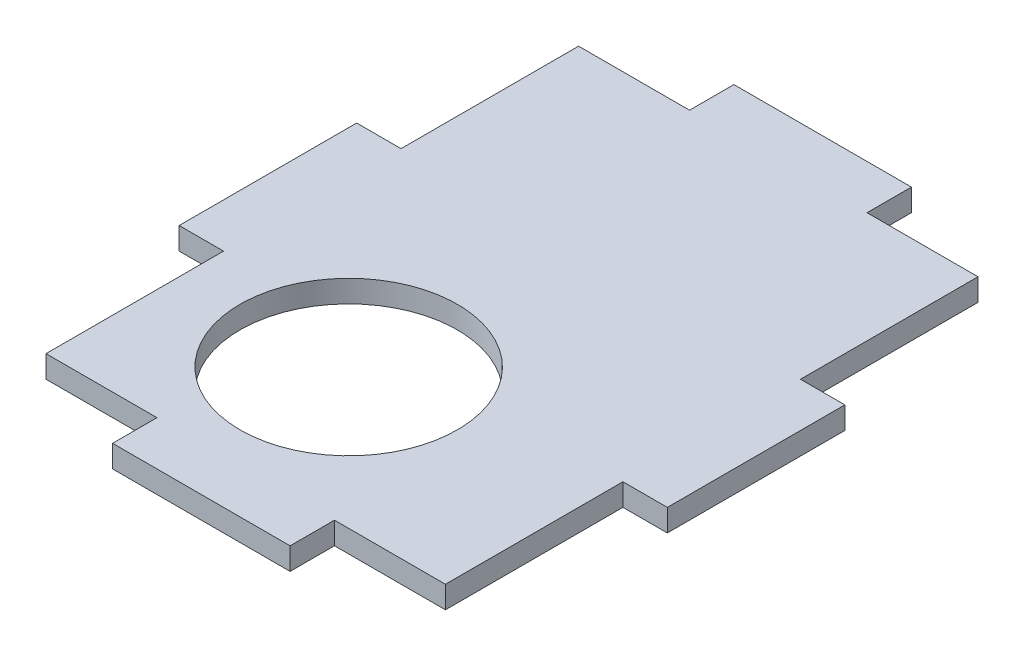
ISO-10303-21;
HEADER;
FILE_DESCRIPTION(('STEP AP214'),'2;1');
FILE_NAME('part.step','',(''),(''),'','','');
FILE_SCHEMA(('AUTOMOTIVE_DESIGN { 1 0 10303 214 1 1 1 1 }'));
ENDSEC;
DATA;
#1=APPLICATION_CONTEXT('core data for automotive mechanical design processes');
#2=APPLICATION_PROTOCOL_DEFINITION('international standard','automotive_design',2000,#1);
#3=PRODUCT_CONTEXT('',#1,'mechanical');
#4=PRODUCT('Part','Part','',(#3));
#5=PRODUCT_RELATED_PRODUCT_CATEGORY('part','',(#4));
#6=PRODUCT_DEFINITION_FORMATION('','',#4);
#7=PRODUCT_DEFINITION_CONTEXT('part definition',#1,'design');
#8=PRODUCT_DEFINITION('design','',#6,#7);
#9=PRODUCT_DEFINITION_SHAPE('','',#8);
#10=(LENGTH_UNIT() NAMED_UNIT(*) SI_UNIT(.MILLI.,.METRE.));
#11=(NAMED_UNIT(*) PLANE_ANGLE_UNIT() SI_UNIT($,.RADIAN.));
#12=(NAMED_UNIT(*) SI_UNIT($,.STERADIAN.) SOLID_ANGLE_UNIT());
#13=UNCERTAINTY_MEASURE_WITH_UNIT(LENGTH_MEASURE(1.E-05),#10,'distance_accuracy_value','');
#14=(GEOMETRIC_REPRESENTATION_CONTEXT(3) GLOBAL_UNCERTAINTY_ASSIGNED_CONTEXT((#13)) GLOBAL_UNIT_ASSIGNED_CONTEXT((#10,
#11,#12)) REPRESENTATION_CONTEXT('',''));
#15=CARTESIAN_POINT('',(0.,0.,0.));
#16=DIRECTION('',(0.,0.,1.));
#17=DIRECTION('',(1.,0.,0.));
#18=AXIS2_PLACEMENT_3D('',#15,#16,#17);
#19=CARTESIAN_POINT('',(0.,5.,0.));
#20=DIRECTION('',(-1.,0.,0.));
#21=DIRECTION('',(0.,0.,1.));
#22=AXIS2_PLACEMENT_3D('',#19,#20,#21);
#23=PLANE('',#22);
#24=DIRECTION('',(0.,0.,-1.));
#25=VECTOR('',#24,1.);
#26=CARTESIAN_POINT('',(0.,0.,0.));
#27=LINE('',#26,#25);
#28=CARTESIAN_POINT('',(0.,0.,0.));
#29=VERTEX_POINT('',#28);
#30=CARTESIAN_POINT('',(0.,0.,-40.));
#31=VERTEX_POINT('',#30);
#32=EDGE_CURVE('E202',#29,#31,#27,.T.);
#33=ORIENTED_EDGE('',*,*,#32,.F.);
#34=DIRECTION('',(0.,-1.,0.));
#35=VECTOR('',#34,1.);
#36=CARTESIAN_POINT('',(0.,5.,0.));
#37=LINE('',#36,#35);
#38=CARTESIAN_POINT('',(0.,5.,0.));
#39=VERTEX_POINT('',#38);
#40=EDGE_CURVE('E211',#39,#29,#37,.T.);
#41=ORIENTED_EDGE('',*,*,#40,.F.);
#42=DIRECTION('',(0.,0.,-1.));
#43=VECTOR('',#42,1.);
#44=CARTESIAN_POINT('',(0.,5.,0.));
#45=LINE('',#44,#43);
#46=CARTESIAN_POINT('',(0.,5.,-40.));
#47=VERTEX_POINT('',#46);
#48=EDGE_CURVE('E156',#39,#47,#45,.T.);
#49=ORIENTED_EDGE('',*,*,#48,.T.);
#50=DIRECTION('',(0.,-1.,0.));
#51=VECTOR('',#50,1.);
#52=CARTESIAN_POINT('',(0.,5.,-40.));
#53=LINE('',#52,#51);
#54=EDGE_CURVE('E215',#47,#31,#53,.T.);
#55=ORIENTED_EDGE('',*,*,#54,.T.);
#56=EDGE_LOOP('',(#33,#41,#49,#55));
#57=FACE_BOUND('',#56,.T.);
#58=ADVANCED_FACE('F41',(#57),#23,.T.);
#59=CARTESIAN_POINT('',(0.,5.,-40.));
#60=DIRECTION('',(0.,0.,1.));
#61=DIRECTION('',(1.,0.,0.));
#62=AXIS2_PLACEMENT_3D('',#59,#60,#61);
#63=PLANE('',#62);
#64=DIRECTION('',(-1.,0.,0.));
#65=VECTOR('',#64,1.);
#66=CARTESIAN_POINT('',(0.,0.,-40.));
#67=LINE('',#66,#65);
#68=CARTESIAN_POINT('',(-9.99999999999999,0.,-40.));
#69=VERTEX_POINT('',#68);
#70=EDGE_CURVE('E208',#31,#69,#67,.T.);
#71=ORIENTED_EDGE('',*,*,#70,.F.);
#72=ORIENTED_EDGE('',*,*,#54,.F.);
#73=DIRECTION('',(-1.,0.,0.));
#74=VECTOR('',#73,1.);
#75=CARTESIAN_POINT('',(0.,5.,-40.));
#76=LINE('',#75,#74);
#77=CARTESIAN_POINT('',(-9.99999999999999,5.,-40.));
#78=VERTEX_POINT('',#77);
#79=EDGE_CURVE('E162',#47,#78,#76,.T.);
#80=ORIENTED_EDGE('',*,*,#79,.T.);
#81=DIRECTION('',(0.,-1.,0.));
#82=VECTOR('',#81,1.);
#83=CARTESIAN_POINT('',(-9.99999999999999,5.,-40.));
#84=LINE('',#83,#82);
#85=EDGE_CURVE('E218',#78,#69,#84,.T.);
#86=ORIENTED_EDGE('',*,*,#85,.T.);
#87=EDGE_LOOP('',(#71,#72,#80,#86));
#88=FACE_BOUND('',#87,.T.);
#89=ADVANCED_FACE('F396',(#88),#63,.T.);
#90=CARTESIAN_POINT('',(-9.99999999999999,5.,0.));
#91=DIRECTION('',(1.,0.,0.));
#92=DIRECTION('',(0.,0.,-1.));
#93=AXIS2_PLACEMENT_3D('',#90,#91,#92);
#94=PLANE('',#93);
#95=DIRECTION('',(0.,0.,1.));
#96=VECTOR('',#95,1.);
#97=CARTESIAN_POINT('',(-9.99999999999999,0.,0.));
#98=LINE('',#97,#96);
#99=CARTESIAN_POINT('',(-10.,0.,-80.));
#100=VERTEX_POINT('',#99);
#101=EDGE_CURVE('E205',#100,#69,#98,.T.);
#102=ORIENTED_EDGE('',*,*,#101,.T.);
#103=ORIENTED_EDGE('',*,*,#85,.F.);
#104=DIRECTION('',(0.,0.,1.));
#105=VECTOR('',#104,1.);
#106=CARTESIAN_POINT('',(-9.99999999999999,5.,0.));
#107=LINE('',#106,#105);
#108=CARTESIAN_POINT('',(-10.,5.,-80.));
#109=VERTEX_POINT('',#108);
#110=EDGE_CURVE('E159',#109,#78,#107,.T.);
#111=ORIENTED_EDGE('',*,*,#110,.F.);
#112=DIRECTION('',(0.,-1.,0.));
#113=VECTOR('',#112,1.);
#114=CARTESIAN_POINT('',(-10.,5.,-80.));
#115=LINE('',#114,#113);
#116=EDGE_CURVE('E221',#109,#100,#115,.T.);
#117=ORIENTED_EDGE('',*,*,#116,.T.);
#118=EDGE_LOOP('',(#102,#103,#111,#117));
#119=FACE_BOUND('',#118,.T.);
#120=ADVANCED_FACE('F403',(#119),#94,.F.);
#121=CARTESIAN_POINT('',(0.,5.,-80.));
#122=DIRECTION('',(0.,0.,1.));
#123=DIRECTION('',(1.,0.,0.));
#124=AXIS2_PLACEMENT_3D('',#121,#122,#123);
#125=PLANE('',#124);
#126=DIRECTION('',(-1.,0.,0.));
#127=VECTOR('',#126,1.);
#128=CARTESIAN_POINT('',(0.,0.,-80.));
#129=LINE('',#128,#127);
#130=CARTESIAN_POINT('',(0.,0.,-80.));
#131=VERTEX_POINT('',#130);
#132=EDGE_CURVE('E201',#131,#100,#129,.T.);
#133=ORIENTED_EDGE('',*,*,#132,.T.);
#134=ORIENTED_EDGE('',*,*,#116,.F.);
#135=DIRECTION('',(-1.,0.,0.));
#136=VECTOR('',#135,1.);
#137=CARTESIAN_POINT('',(0.,5.,-80.));
#138=LINE('',#137,#136);
#139=CARTESIAN_POINT('',(0.,5.,-80.));
#140=VERTEX_POINT('',#139);
#141=EDGE_CURVE('E155',#140,#109,#138,.T.);
#142=ORIENTED_EDGE('',*,*,#141,.F.);
#143=DIRECTION('',(0.,-1.,0.));
#144=VECTOR('',#143,1.);
#145=CARTESIAN_POINT('',(0.,5.,-80.));
#146=LINE('',#145,#144);
#147=EDGE_CURVE('E224',#140,#131,#146,.T.);
#148=ORIENTED_EDGE('',*,*,#147,.T.);
#149=EDGE_LOOP('',(#133,#134,#142,#148));
#150=FACE_BOUND('',#149,.T.);
#151=ADVANCED_FACE('F422',(#150),#125,.F.);
#152=CARTESIAN_POINT('',(-1.11022302462516E-13,5.,-79.9999999999999));
#153=DIRECTION('',(0.,0.,-1.));
#154=DIRECTION('',(-1.,0.,0.));
#155=AXIS2_PLACEMENT_3D('',#152,#153,#154);
#156=PLANE('',#155);
#157=DIRECTION('',(1.,0.,0.));
#158=VECTOR('',#157,1.);
#159=CARTESIAN_POINT('',(-1.11022302462516E-13,0.,-79.9999999999999));
#160=LINE('',#159,#158);
#161=CARTESIAN_POINT('',(90.,0.,-80.));
#162=VERTEX_POINT('',#161);
#163=CARTESIAN_POINT('',(100.,0.,-80.));
#164=VERTEX_POINT('',#163);
#165=EDGE_CURVE('E192',#162,#164,#160,.T.);
#166=ORIENTED_EDGE('',*,*,#165,.F.);
#167=DIRECTION('',(0.,-1.,0.));
#168=VECTOR('',#167,1.);
#169=CARTESIAN_POINT('',(90.,5.,-80.));
#170=LINE('',#169,#168);
#171=CARTESIAN_POINT('',(90.,5.,-80.));
#172=VERTEX_POINT('',#171);
#173=EDGE_CURVE('E232',#172,#162,#170,.T.);
#174=ORIENTED_EDGE('',*,*,#173,.F.);
#175=DIRECTION('',(1.,0.,0.));
#176=VECTOR('',#175,1.);
#177=CARTESIAN_POINT('',(-1.11022302462516E-13,5.,-79.9999999999999));
#178=LINE('',#177,#176);
#179=CARTESIAN_POINT('',(100.,5.,-80.));
#180=VERTEX_POINT('',#179);
#181=EDGE_CURVE('E147',#172,#180,#178,.T.);
#182=ORIENTED_EDGE('',*,*,#181,.T.);
#183=DIRECTION('',(0.,-1.,0.));
#184=VECTOR('',#183,1.);
#185=CARTESIAN_POINT('',(100.,5.,-80.));
#186=LINE('',#185,#184);
#187=EDGE_CURVE('E235',#180,#164,#186,.T.);
#188=ORIENTED_EDGE('',*,*,#187,.T.);
#189=EDGE_LOOP('',(#166,#174,#182,#188));
#190=FACE_BOUND('',#189,.T.);
#191=ADVANCED_FACE('F312',(#190),#156,.T.);
#192=CARTESIAN_POINT('',(100.,5.,0.));
#193=DIRECTION('',(1.,0.,0.));
#194=DIRECTION('',(0.,0.,-1.));
#195=AXIS2_PLACEMENT_3D('',#192,#193,#194);
#196=PLANE('',#195);
#197=DIRECTION('',(0.,0.,1.));
#198=VECTOR('',#197,1.);
#199=CARTESIAN_POINT('',(100.,0.,0.));
#200=LINE('',#199,#198);
#201=CARTESIAN_POINT('',(100.,0.,-40.));
#202=VERTEX_POINT('',#201);
#203=EDGE_CURVE('E189',#164,#202,#200,.T.);
#204=ORIENTED_EDGE('',*,*,#203,.F.);
#205=ORIENTED_EDGE('',*,*,#187,.F.);
#206=DIRECTION('',(0.,0.,1.));
#207=VECTOR('',#206,1.);
#208=CARTESIAN_POINT('',(100.,5.,0.));
#209=LINE('',#208,#207);
#210=CARTESIAN_POINT('',(100.,5.,-40.));
#211=VERTEX_POINT('',#210);
#212=EDGE_CURVE('E296',#180,#211,#209,.T.);
#213=ORIENTED_EDGE('',*,*,#212,.T.);
#214=DIRECTION('',(0.,-1.,0.));
#215=VECTOR('',#214,1.);
#216=CARTESIAN_POINT('',(100.,5.,-40.));
#217=LINE('',#216,#215);
#218=EDGE_CURVE('E238',#211,#202,#217,.T.);
#219=ORIENTED_EDGE('',*,*,#218,.T.);
#220=EDGE_LOOP('',(#204,#205,#213,#219));
#221=FACE_BOUND('',#220,.T.);
#222=ADVANCED_FACE('F379',(#221),#196,.T.);
#223=CARTESIAN_POINT('',(0.,5.,-39.9999999999999));
#224=DIRECTION('',(0.,0.,-1.));
#225=DIRECTION('',(-1.,0.,0.));
#226=AXIS2_PLACEMENT_3D('',#223,#224,#225);
#227=PLANE('',#226);
#228=DIRECTION('',(1.,0.,0.));
#229=VECTOR('',#228,1.);
#230=CARTESIAN_POINT('',(0.,0.,-39.9999999999999));
#231=LINE('',#230,#229);
#232=CARTESIAN_POINT('',(90.,0.,-40.));
#233=VERTEX_POINT('',#232);
#234=EDGE_CURVE('E185',#233,#202,#231,.T.);
#235=ORIENTED_EDGE('',*,*,#234,.T.);
#236=ORIENTED_EDGE('',*,*,#218,.F.);
#237=DIRECTION('',(1.,0.,0.));
#238=VECTOR('',#237,1.);
#239=CARTESIAN_POINT('',(0.,5.,-39.9999999999999));
#240=LINE('',#239,#238);
#241=CARTESIAN_POINT('',(90.,5.,-40.));
#242=VERTEX_POINT('',#241);
#243=EDGE_CURVE('E294',#242,#211,#240,.T.);
#244=ORIENTED_EDGE('',*,*,#243,.F.);
#245=DIRECTION('',(0.,-1.,0.));
#246=VECTOR('',#245,1.);
#247=CARTESIAN_POINT('',(90.,5.,-40.));
#248=LINE('',#247,#246);
#249=EDGE_CURVE('E241',#242,#233,#248,.T.);
#250=ORIENTED_EDGE('',*,*,#249,.T.);
#251=EDGE_LOOP('',(#235,#236,#244,#250));
#252=FACE_BOUND('',#251,.T.);
#253=ADVANCED_FACE('F378',(#252),#227,.F.);
#254=CARTESIAN_POINT('',(90.,5.,0.));
#255=DIRECTION('',(-1.,0.,0.));
#256=DIRECTION('',(0.,0.,1.));
#257=AXIS2_PLACEMENT_3D('',#254,#255,#256);
#258=PLANE('',#257);
#259=DIRECTION('',(0.,0.,-1.));
#260=VECTOR('',#259,1.);
#261=CARTESIAN_POINT('',(90.,0.,0.));
#262=LINE('',#261,#260);
#263=CARTESIAN_POINT('',(90.,0.,0.));
#264=VERTEX_POINT('',#263);
#265=EDGE_CURVE('E182',#264,#233,#262,.T.);
#266=ORIENTED_EDGE('',*,*,#265,.T.);
#267=ORIENTED_EDGE('',*,*,#249,.F.);
#268=DIRECTION('',(0.,0.,-1.));
#269=VECTOR('',#268,1.);
#270=CARTESIAN_POINT('',(90.,5.,0.));
#271=LINE('',#270,#269);
#272=CARTESIAN_POINT('',(90.,5.,0.));
#273=VERTEX_POINT('',#272);
#274=EDGE_CURVE('E149',#273,#242,#271,.T.);
#275=ORIENTED_EDGE('',*,*,#274,.F.);
#276=DIRECTION('',(0.,-1.,0.));
#277=VECTOR('',#276,1.);
#278=CARTESIAN_POINT('',(90.,5.,0.));
#279=LINE('',#278,#277);
#280=EDGE_CURVE('E244',#273,#264,#279,.T.);
#281=ORIENTED_EDGE('',*,*,#280,.T.);
#282=EDGE_LOOP('',(#266,#267,#275,#281));
#283=FACE_BOUND('',#282,.T.);
#284=ADVANCED_FACE('F285',(#283),#258,.F.);
#285=CARTESIAN_POINT('',(0.,5.,0.));
#286=DIRECTION('',(0.,0.,-1.));
#287=DIRECTION('',(-1.,0.,0.));
#288=AXIS2_PLACEMENT_3D('',#285,#286,#287);
#289=PLANE('',#288);
#290=DIRECTION('',(1.,0.,0.));
#291=VECTOR('',#290,1.);
#292=CARTESIAN_POINT('',(0.,0.,0.));
#293=LINE('',#292,#291);
#294=CARTESIAN_POINT('',(65.,0.,0.));
#295=VERTEX_POINT('',#294);
#296=EDGE_CURVE('E172',#295,#264,#293,.T.);
#297=ORIENTED_EDGE('',*,*,#296,.T.);
#298=ORIENTED_EDGE('',*,*,#280,.F.);
#299=DIRECTION('',(1.,0.,0.));
#300=VECTOR('',#299,1.);
#301=CARTESIAN_POINT('',(0.,5.,0.));
#302=LINE('',#301,#300);
#303=CARTESIAN_POINT('',(65.,5.,0.));
#304=VERTEX_POINT('',#303);
#305=EDGE_CURVE('E295',#304,#273,#302,.T.);
#306=ORIENTED_EDGE('',*,*,#305,.F.);
#307=DIRECTION('',(0.,-1.,0.));
#308=VECTOR('',#307,1.);
#309=CARTESIAN_POINT('',(65.,5.,0.));
#310=LINE('',#309,#308);
#311=EDGE_CURVE('E247',#304,#295,#310,.T.);
#312=ORIENTED_EDGE('',*,*,#311,.T.);
#313=EDGE_LOOP('',(#297,#298,#306,#312));
#314=FACE_BOUND('',#313,.T.);
#315=ADVANCED_FACE('F278',(#314),#289,.F.);
#316=CARTESIAN_POINT('',(65.,5.,0.));
#317=DIRECTION('',(1.,0.,0.));
#318=DIRECTION('',(0.,0.,-1.));
#319=AXIS2_PLACEMENT_3D('',#316,#317,#318);
#320=PLANE('',#319);
#321=DIRECTION('',(0.,0.,1.));
#322=VECTOR('',#321,1.);
#323=CARTESIAN_POINT('',(65.,0.,0.));
#324=LINE('',#323,#322);
#325=CARTESIAN_POINT('',(65.,0.,10.));
#326=VERTEX_POINT('',#325);
#327=EDGE_CURVE('E179',#295,#326,#324,.T.);
#328=ORIENTED_EDGE('',*,*,#327,.F.);
#329=ORIENTED_EDGE('',*,*,#311,.F.);
#330=DIRECTION('',(0.,0.,1.));
#331=VECTOR('',#330,1.);
#332=CARTESIAN_POINT('',(65.,5.,0.));
#333=LINE('',#332,#331);
#334=CARTESIAN_POINT('',(65.,5.,10.));
#335=VERTEX_POINT('',#334);
#336=EDGE_CURVE('E261',#304,#335,#333,.T.);
#337=ORIENTED_EDGE('',*,*,#336,.T.);
#338=DIRECTION('',(0.,-1.,0.));
#339=VECTOR('',#338,1.);
#340=CARTESIAN_POINT('',(65.,5.,10.));
#341=LINE('',#340,#339);
#342=EDGE_CURVE('E125',#335,#326,#341,.T.);
#343=ORIENTED_EDGE('',*,*,#342,.T.);
#344=EDGE_LOOP('',(#328,#329,#337,#343));
#345=FACE_BOUND('',#344,.T.);
#346=ADVANCED_FACE('F256',(#345),#320,.T.);
#347=CARTESIAN_POINT('',(0.,5.,10.));
#348=DIRECTION('',(0.,0.,1.));
#349=DIRECTION('',(1.,0.,0.));
#350=AXIS2_PLACEMENT_3D('',#347,#348,#349);
#351=PLANE('',#350);
#352=DIRECTION('',(-1.,0.,0.));
#353=VECTOR('',#352,1.);
#354=CARTESIAN_POINT('',(0.,0.,10.));
#355=LINE('',#354,#353);
#356=CARTESIAN_POINT('',(25.,0.,10.));
#357=VERTEX_POINT('',#356);
#358=EDGE_CURVE('E175',#326,#357,#355,.T.);
#359=ORIENTED_EDGE('',*,*,#358,.F.);
#360=ORIENTED_EDGE('',*,*,#342,.F.);
#361=DIRECTION('',(-1.,0.,0.));
#362=VECTOR('',#361,1.);
#363=CARTESIAN_POINT('',(0.,5.,10.));
#364=LINE('',#363,#362);
#365=CARTESIAN_POINT('',(25.,5.,10.));
#366=VERTEX_POINT('',#365);
#367=EDGE_CURVE('E442',#335,#366,#364,.T.);
#368=ORIENTED_EDGE('',*,*,#367,.T.);
#369=DIRECTION('',(0.,-1.,0.));
#370=VECTOR('',#369,1.);
#371=CARTESIAN_POINT('',(25.,5.,10.));
#372=LINE('',#371,#370);
#373=EDGE_CURVE('E114',#366,#357,#372,.T.);
#374=ORIENTED_EDGE('',*,*,#373,.T.);
#375=EDGE_LOOP('',(#359,#360,#368,#374));
#376=FACE_BOUND('',#375,.T.);
#377=ADVANCED_FACE('F267',(#376),#351,.T.);
#378=CARTESIAN_POINT('',(25.,5.,0.));
#379=DIRECTION('',(1.,0.,0.));
#380=DIRECTION('',(0.,0.,-1.));
#381=AXIS2_PLACEMENT_3D('',#378,#379,#380);
#382=PLANE('',#381);
#383=DIRECTION('',(0.,0.,1.));
#384=VECTOR('',#383,1.);
#385=CARTESIAN_POINT('',(25.,0.,0.));
#386=LINE('',#385,#384);
#387=CARTESIAN_POINT('',(25.,0.,0.));
#388=VERTEX_POINT('',#387);
#389=EDGE_CURVE('E171',#388,#357,#386,.T.);
#390=ORIENTED_EDGE('',*,*,#389,.T.);
#391=ORIENTED_EDGE('',*,*,#373,.F.);
#392=DIRECTION('',(0.,0.,1.));
#393=VECTOR('',#392,1.);
#394=CARTESIAN_POINT('',(25.,5.,0.));
#395=LINE('',#394,#393);
#396=CARTESIAN_POINT('',(25.,5.,0.));
#397=VERTEX_POINT('',#396);
#398=EDGE_CURVE('E371',#397,#366,#395,.T.);
#399=ORIENTED_EDGE('',*,*,#398,.F.);
#400=DIRECTION('',(0.,-1.,0.));
#401=VECTOR('',#400,1.);
#402=CARTESIAN_POINT('',(25.,5.,0.));
#403=LINE('',#402,#401);
#404=EDGE_CURVE('E107',#397,#388,#403,.T.);
#405=ORIENTED_EDGE('',*,*,#404,.T.);
#406=EDGE_LOOP('',(#390,#391,#399,#405));
#407=FACE_BOUND('',#406,.T.);
#408=ADVANCED_FACE('F444',(#407),#382,.F.);
#409=EDGE_CURVE('E168',#29,#388,#293,.T.);
#410=ORIENTED_EDGE('',*,*,#409,.T.);
#411=ORIENTED_EDGE('',*,*,#404,.F.);
#412=EDGE_CURVE('E299',#39,#397,#302,.T.);
#413=ORIENTED_EDGE('',*,*,#412,.F.);
#414=ORIENTED_EDGE('',*,*,#40,.T.);
#415=EDGE_LOOP('',(#410,#411,#413,#414));
#416=FACE_BOUND('',#415,.T.);
#417=ADVANCED_FACE('F445',(#416),#289,.F.);
#418=CARTESIAN_POINT('',(36.72,5.,-31.48));
#419=DIRECTION('',(0.,-1.,0.));
#420=DIRECTION('',(0.,0.,-1.));
#421=AXIS2_PLACEMENT_3D('',#418,#419,#420);
#422=CYLINDRICAL_SURFACE('',#421,24.5);
#423=CARTESIAN_POINT('',(36.72,5.,-31.48));
#424=DIRECTION('',(0.,1.,0.));
#425=DIRECTION('',(0.,0.,1.));
#426=AXIS2_PLACEMENT_3D('',#423,#424,#425);
#427=CIRCLE('',#426,24.5);
#428=CARTESIAN_POINT('',(36.72,5.,-6.98));
#429=VERTEX_POINT('',#428);
#430=EDGE_CURVE('E434',#429,#429,#427,.T.);
#431=ORIENTED_EDGE('',*,*,#430,.T.);
#432=EDGE_LOOP('',(#431));
#433=FACE_BOUND('',#432,.T.);
#434=CARTESIAN_POINT('',(36.72,0.,-31.48));
#435=DIRECTION('',(0.,1.,0.));
#436=DIRECTION('',(0.,0.,1.));
#437=AXIS2_PLACEMENT_3D('',#434,#435,#436);
#438=CIRCLE('',#437,24.5);
#439=CARTESIAN_POINT('',(36.72,0.,-6.98));
#440=VERTEX_POINT('',#439);
#441=EDGE_CURVE('E90',#440,#440,#438,.T.);
#442=ORIENTED_EDGE('',*,*,#441,.F.);
#443=EDGE_LOOP('',(#442));
#444=FACE_BOUND('',#443,.T.);
#445=ADVANCED_FACE('F415',(#433,#444),#422,.F.);
#446=CARTESIAN_POINT('',(90.,0.,-120.));
#447=VERTEX_POINT('',#446);
#448=EDGE_CURVE('E186',#162,#447,#262,.T.);
#449=ORIENTED_EDGE('',*,*,#448,.T.);
#450=DIRECTION('',(0.,-1.,0.));
#451=VECTOR('',#450,1.);
#452=CARTESIAN_POINT('',(90.,5.,-120.));
#453=LINE('',#452,#451);
#454=CARTESIAN_POINT('',(90.,5.,-120.));
#455=VERTEX_POINT('',#454);
#456=EDGE_CURVE('E230',#455,#447,#453,.T.);
#457=ORIENTED_EDGE('',*,*,#456,.F.);
#458=EDGE_CURVE('E141',#172,#455,#271,.T.);
#459=ORIENTED_EDGE('',*,*,#458,.F.);
#460=ORIENTED_EDGE('',*,*,#173,.T.);
#461=EDGE_LOOP('',(#449,#457,#459,#460));
#462=FACE_BOUND('',#461,.T.);
#463=ADVANCED_FACE('F383',(#462),#258,.F.);
#464=CARTESIAN_POINT('',(0.,0.,-120.));
#465=VERTEX_POINT('',#464);
#466=EDGE_CURVE('E197',#131,#465,#27,.T.);
#467=ORIENTED_EDGE('',*,*,#466,.F.);
#468=ORIENTED_EDGE('',*,*,#147,.F.);
#469=CARTESIAN_POINT('',(0.,5.,-120.));
#470=VERTEX_POINT('',#469);
#471=EDGE_CURVE('E146',#140,#470,#45,.T.);
#472=ORIENTED_EDGE('',*,*,#471,.T.);
#473=DIRECTION('',(0.,-1.,0.));
#474=VECTOR('',#473,1.);
#475=CARTESIAN_POINT('',(0.,5.,-120.));
#476=LINE('',#475,#474);
#477=EDGE_CURVE('E227',#470,#465,#476,.T.);
#478=ORIENTED_EDGE('',*,*,#477,.T.);
#479=EDGE_LOOP('',(#467,#468,#472,#478));
#480=FACE_BOUND('',#479,.T.);
#481=ADVANCED_FACE('F399',(#480),#23,.T.);
#482=CARTESIAN_POINT('',(0.,0.,0.));
#483=DIRECTION('',(0.,1.,0.));
#484=DIRECTION('',(0.,0.,1.));
#485=AXIS2_PLACEMENT_3D('',#482,#483,#484);
#486=PLANE('',#485);
#487=ORIENTED_EDGE('',*,*,#441,.T.);
#488=EDGE_LOOP('',(#487));
#489=FACE_BOUND('',#488,.T.);
#490=ORIENTED_EDGE('',*,*,#409,.F.);
#491=ORIENTED_EDGE('',*,*,#32,.T.);
#492=ORIENTED_EDGE('',*,*,#70,.T.);
#493=ORIENTED_EDGE('',*,*,#101,.F.);
#494=ORIENTED_EDGE('',*,*,#132,.F.);
#495=ORIENTED_EDGE('',*,*,#466,.T.);
#496=DIRECTION('',(1.,0.,0.));
#497=VECTOR('',#496,1.);
#498=CARTESIAN_POINT('',(0.,0.,-120.));
#499=LINE('',#498,#497);
#500=CARTESIAN_POINT('',(25.,0.,-120.));
#501=VERTEX_POINT('',#500);
#502=EDGE_CURVE('E195',#465,#501,#499,.T.);
#503=ORIENTED_EDGE('',*,*,#502,.T.);
#504=DIRECTION('',(0.,0.,-1.));
#505=VECTOR('',#504,1.);
#506=CARTESIAN_POINT('',(25.,0.,-120.));
#507=LINE('',#506,#505);
#508=CARTESIAN_POINT('',(25.,0.,-130.));
#509=VERTEX_POINT('',#508);
#510=EDGE_CURVE('E101',#501,#509,#507,.T.);
#511=ORIENTED_EDGE('',*,*,#510,.T.);
#512=DIRECTION('',(1.,0.,0.));
#513=VECTOR('',#512,1.);
#514=CARTESIAN_POINT('',(25.,0.,-130.));
#515=LINE('',#514,#513);
#516=CARTESIAN_POINT('',(65.,0.,-130.));
#517=VERTEX_POINT('',#516);
#518=EDGE_CURVE('E85',#509,#517,#515,.T.);
#519=ORIENTED_EDGE('',*,*,#518,.T.);
#520=DIRECTION('',(0.,0.,-1.));
#521=VECTOR('',#520,1.);
#522=CARTESIAN_POINT('',(65.,0.,-120.));
#523=LINE('',#522,#521);
#524=CARTESIAN_POINT('',(65.,0.,-120.));
#525=VERTEX_POINT('',#524);
#526=EDGE_CURVE('E92',#525,#517,#523,.T.);
#527=ORIENTED_EDGE('',*,*,#526,.F.);
#528=EDGE_CURVE('E198',#525,#447,#499,.T.);
#529=ORIENTED_EDGE('',*,*,#528,.T.);
#530=ORIENTED_EDGE('',*,*,#448,.F.);
#531=ORIENTED_EDGE('',*,*,#165,.T.);
#532=ORIENTED_EDGE('',*,*,#203,.T.);
#533=ORIENTED_EDGE('',*,*,#234,.F.);
#534=ORIENTED_EDGE('',*,*,#265,.F.);
#535=ORIENTED_EDGE('',*,*,#296,.F.);
#536=ORIENTED_EDGE('',*,*,#327,.T.);
#537=ORIENTED_EDGE('',*,*,#358,.T.);
#538=ORIENTED_EDGE('',*,*,#389,.F.);
#539=EDGE_LOOP('',(#490,#491,#492,#493,#494,#495,#503,#511,#519,#527,#529,#530,#531,#532,#533,
#534,#535,#536,#537,#538));
#540=FACE_BOUND('',#539,.T.);
#541=ADVANCED_FACE('F99',(#489,#540),#486,.F.);
#542=CARTESIAN_POINT('',(0.,5.,0.));
#543=DIRECTION('',(0.,1.,0.));
#544=DIRECTION('',(0.,0.,1.));
#545=AXIS2_PLACEMENT_3D('',#542,#543,#544);
#546=PLANE('',#545);
#547=ORIENTED_EDGE('',*,*,#430,.F.);
#548=EDGE_LOOP('',(#547));
#549=FACE_BOUND('',#548,.T.);
#550=ORIENTED_EDGE('',*,*,#412,.T.);
#551=ORIENTED_EDGE('',*,*,#398,.T.);
#552=ORIENTED_EDGE('',*,*,#367,.F.);
#553=ORIENTED_EDGE('',*,*,#336,.F.);
#554=ORIENTED_EDGE('',*,*,#305,.T.);
#555=ORIENTED_EDGE('',*,*,#274,.T.);
#556=ORIENTED_EDGE('',*,*,#243,.T.);
#557=ORIENTED_EDGE('',*,*,#212,.F.);
#558=ORIENTED_EDGE('',*,*,#181,.F.);
#559=ORIENTED_EDGE('',*,*,#458,.T.);
#560=DIRECTION('',(1.,0.,0.));
#561=VECTOR('',#560,1.);
#562=CARTESIAN_POINT('',(0.,5.,-120.));
#563=LINE('',#562,#561);
#564=CARTESIAN_POINT('',(65.,5.,-120.));
#565=VERTEX_POINT('',#564);
#566=EDGE_CURVE('E137',#565,#455,#563,.T.);
#567=ORIENTED_EDGE('',*,*,#566,.F.);
#568=DIRECTION('',(0.,0.,-1.));
#569=VECTOR('',#568,1.);
#570=CARTESIAN_POINT('',(65.,5.,-120.));
#571=LINE('',#570,#569);
#572=CARTESIAN_POINT('',(65.,5.,-130.));
#573=VERTEX_POINT('',#572);
#574=EDGE_CURVE('E130',#565,#573,#571,.T.);
#575=ORIENTED_EDGE('',*,*,#574,.T.);
#576=DIRECTION('',(1.,0.,0.));
#577=VECTOR('',#576,1.);
#578=CARTESIAN_POINT('',(25.,5.,-130.));
#579=LINE('',#578,#577);
#580=CARTESIAN_POINT('',(25.,5.,-130.));
#581=VERTEX_POINT('',#580);
#582=EDGE_CURVE('E88',#581,#573,#579,.T.);
#583=ORIENTED_EDGE('',*,*,#582,.F.);
#584=DIRECTION('',(0.,0.,-1.));
#585=VECTOR('',#584,1.);
#586=CARTESIAN_POINT('',(25.,5.,-120.));
#587=LINE('',#586,#585);
#588=CARTESIAN_POINT('',(25.,5.,-120.));
#589=VERTEX_POINT('',#588);
#590=EDGE_CURVE('E96',#589,#581,#587,.T.);
#591=ORIENTED_EDGE('',*,*,#590,.F.);
#592=EDGE_CURVE('E144',#470,#589,#563,.T.);
#593=ORIENTED_EDGE('',*,*,#592,.F.);
#594=ORIENTED_EDGE('',*,*,#471,.F.);
#595=ORIENTED_EDGE('',*,*,#141,.T.);
#596=ORIENTED_EDGE('',*,*,#110,.T.);
#597=ORIENTED_EDGE('',*,*,#79,.F.);
#598=ORIENTED_EDGE('',*,*,#48,.F.);
#599=EDGE_LOOP('',(#550,#551,#552,#553,#554,#555,#556,#557,#558,#559,#567,#575,#583,#591,#593,
#594,#595,#596,#597,#598));
#600=FACE_BOUND('',#599,.T.);
#601=ADVANCED_FACE('F134',(#549,#600),#546,.T.);
#602=CARTESIAN_POINT('',(0.,5.,-120.));
#603=DIRECTION('',(0.,0.,-1.));
#604=DIRECTION('',(-1.,0.,0.));
#605=AXIS2_PLACEMENT_3D('',#602,#603,#604);
#606=PLANE('',#605);
#607=ORIENTED_EDGE('',*,*,#592,.T.);
#608=DIRECTION('',(0.,-1.,0.));
#609=VECTOR('',#608,1.);
#610=CARTESIAN_POINT('',(25.,5.,-120.));
#611=LINE('',#610,#609);
#612=EDGE_CURVE('E51',#589,#501,#611,.T.);
#613=ORIENTED_EDGE('',*,*,#612,.T.);
#614=ORIENTED_EDGE('',*,*,#502,.F.);
#615=ORIENTED_EDGE('',*,*,#477,.F.);
#616=EDGE_LOOP('',(#607,#613,#614,#615));
#617=FACE_BOUND('',#616,.T.);
#618=ADVANCED_FACE('F386',(#617),#606,.T.);
#619=DIRECTION('',(0.,-1.,0.));
#620=VECTOR('',#619,1.);
#621=CARTESIAN_POINT('',(65.,5.,-120.));
#622=LINE('',#621,#620);
#623=EDGE_CURVE('E11',#565,#525,#622,.T.);
#624=ORIENTED_EDGE('',*,*,#623,.F.);
#625=ORIENTED_EDGE('',*,*,#566,.T.);
#626=ORIENTED_EDGE('',*,*,#456,.T.);
#627=ORIENTED_EDGE('',*,*,#528,.F.);
#628=EDGE_LOOP('',(#624,#625,#626,#627));
#629=FACE_BOUND('',#628,.T.);
#630=ADVANCED_FACE('F384',(#629),#606,.T.);
#631=CARTESIAN_POINT('',(25.,5.,-130.));
#632=DIRECTION('',(0.,0.,-1.));
#633=DIRECTION('',(-1.,0.,0.));
#634=AXIS2_PLACEMENT_3D('',#631,#632,#633);
#635=PLANE('',#634);
#636=ORIENTED_EDGE('',*,*,#518,.F.);
#637=DIRECTION('',(0.,-1.,0.));
#638=VECTOR('',#637,1.);
#639=CARTESIAN_POINT('',(25.,5.,-130.));
#640=LINE('',#639,#638);
#641=EDGE_CURVE('E45',#581,#509,#640,.T.);
#642=ORIENTED_EDGE('',*,*,#641,.F.);
#643=ORIENTED_EDGE('',*,*,#582,.T.);
#644=DIRECTION('',(0.,-1.,0.));
#645=VECTOR('',#644,1.);
#646=CARTESIAN_POINT('',(65.,5.,-130.));
#647=LINE('',#646,#645);
#648=EDGE_CURVE('E81',#573,#517,#647,.T.);
#649=ORIENTED_EDGE('',*,*,#648,.T.);
#650=EDGE_LOOP('',(#636,#642,#643,#649));
#651=FACE_BOUND('',#650,.T.);
#652=ADVANCED_FACE('F83',(#651),#635,.T.);
#653=CARTESIAN_POINT('',(25.,5.,-120.));
#654=DIRECTION('',(-1.,0.,0.));
#655=DIRECTION('',(0.,0.,1.));
#656=AXIS2_PLACEMENT_3D('',#653,#654,#655);
#657=PLANE('',#656);
#658=ORIENTED_EDGE('',*,*,#510,.F.);
#659=ORIENTED_EDGE('',*,*,#612,.F.);
#660=ORIENTED_EDGE('',*,*,#590,.T.);
#661=ORIENTED_EDGE('',*,*,#641,.T.);
#662=EDGE_LOOP('',(#658,#659,#660,#661));
#663=FACE_BOUND('',#662,.T.);
#664=ADVANCED_FACE('F43',(#663),#657,.T.);
#665=CARTESIAN_POINT('',(65.,5.,-120.));
#666=DIRECTION('',(-1.,0.,0.));
#667=DIRECTION('',(0.,0.,1.));
#668=AXIS2_PLACEMENT_3D('',#665,#666,#667);
#669=PLANE('',#668);
#670=ORIENTED_EDGE('',*,*,#526,.T.);
#671=ORIENTED_EDGE('',*,*,#648,.F.);
#672=ORIENTED_EDGE('',*,*,#574,.F.);
#673=ORIENTED_EDGE('',*,*,#623,.T.);
#674=EDGE_LOOP('',(#670,#671,#672,#673));
#675=FACE_BOUND('',#674,.T.);
#676=ADVANCED_FACE('F93',(#675),#669,.F.);
#677=CLOSED_SHELL('',(#58,#89,#120,#151,#191,#222,#253,#284,#315,#346,#377,#408,#417,#445,#463,
#481,#541,#601,#618,#630,#652,#664,#676));
#678=MANIFOLD_SOLID_BREP('B2',#677);
#679=ADVANCED_BREP_SHAPE_REPRESENTATION('',(#18,#678),#14);
#680=SHAPE_DEFINITION_REPRESENTATION(#9,#679);
ENDSEC;
END-ISO-10303-21;
